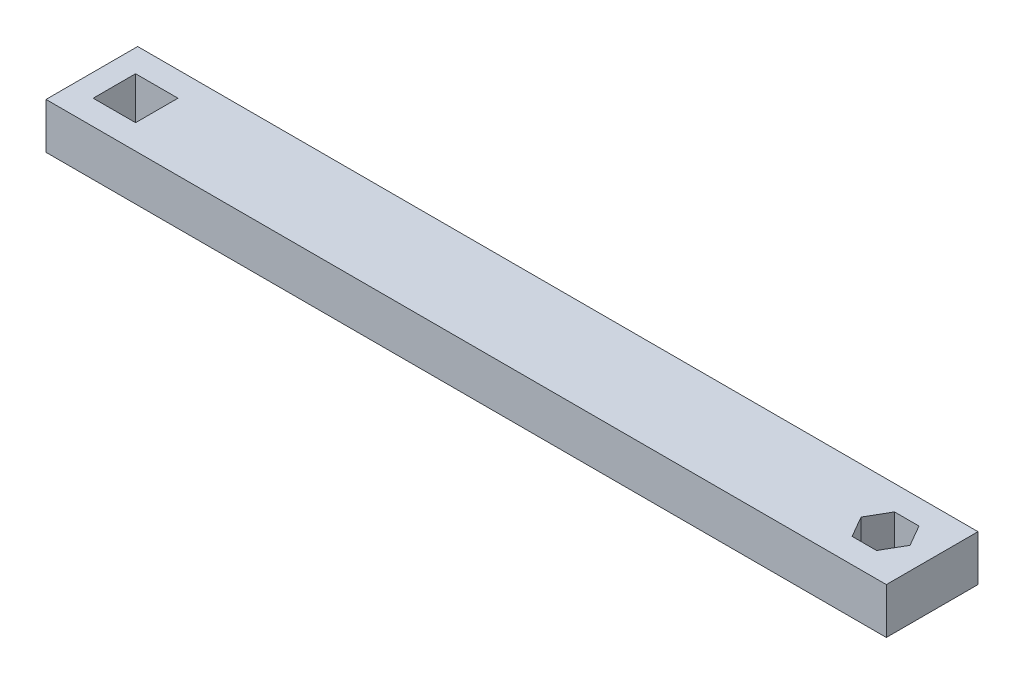
ISO-10303-21;
HEADER;
FILE_DESCRIPTION(('STEP AP214'),'2;1');
FILE_NAME('part.step','',(''),(''),'','','');
FILE_SCHEMA(('AUTOMOTIVE_DESIGN { 1 0 10303 214 1 1 1 1 }'));
ENDSEC;
DATA;
#1=APPLICATION_CONTEXT('core data for automotive mechanical design processes');
#2=APPLICATION_PROTOCOL_DEFINITION('international standard','automotive_design',2000,#1);
#3=PRODUCT_CONTEXT('',#1,'mechanical');
#4=PRODUCT('Part','Part','',(#3));
#5=PRODUCT_RELATED_PRODUCT_CATEGORY('part','',(#4));
#6=PRODUCT_DEFINITION_FORMATION('','',#4);
#7=PRODUCT_DEFINITION_CONTEXT('part definition',#1,'design');
#8=PRODUCT_DEFINITION('design','',#6,#7);
#9=PRODUCT_DEFINITION_SHAPE('','',#8);
#10=(LENGTH_UNIT() NAMED_UNIT(*) SI_UNIT(.MILLI.,.METRE.));
#11=(NAMED_UNIT(*) PLANE_ANGLE_UNIT() SI_UNIT($,.RADIAN.));
#12=(NAMED_UNIT(*) SI_UNIT($,.STERADIAN.) SOLID_ANGLE_UNIT());
#13=UNCERTAINTY_MEASURE_WITH_UNIT(LENGTH_MEASURE(1.E-05),#10,'distance_accuracy_value','');
#14=(GEOMETRIC_REPRESENTATION_CONTEXT(3) GLOBAL_UNCERTAINTY_ASSIGNED_CONTEXT((#13)) GLOBAL_UNIT_ASSIGNED_CONTEXT((#10,
#11,#12)) REPRESENTATION_CONTEXT('',''));
#15=CARTESIAN_POINT('',(0.,0.,0.));
#16=DIRECTION('',(0.,0.,1.));
#17=DIRECTION('',(1.,0.,0.));
#18=AXIS2_PLACEMENT_3D('',#15,#16,#17);
#19=CARTESIAN_POINT('',(0.,6.,84.2413308134273));
#20=DIRECTION('',(0.,0.,1.));
#21=DIRECTION('',(1.,0.,0.));
#22=AXIS2_PLACEMENT_3D('',#19,#20,#21);
#23=PLANE('',#22);
#24=DIRECTION('',(-1.,0.,0.));
#25=VECTOR('',#24,1.);
#26=CARTESIAN_POINT('',(0.,0.,84.2413308134273));
#27=LINE('',#26,#25);
#28=CARTESIAN_POINT('',(110.,0.,84.2413308134273));
#29=VERTEX_POINT('',#28);
#30=CARTESIAN_POINT('',(0.,0.,84.2413308134273));
#31=VERTEX_POINT('',#30);
#32=EDGE_CURVE('E213',#29,#31,#27,.T.);
#33=ORIENTED_EDGE('',*,*,#32,.T.);
#34=DIRECTION('',(0.,-1.,0.));
#35=VECTOR('',#34,1.);
#36=CARTESIAN_POINT('',(0.,6.,84.2413308134273));
#37=LINE('',#36,#35);
#38=CARTESIAN_POINT('',(0.,6.,84.2413308134273));
#39=VERTEX_POINT('',#38);
#40=EDGE_CURVE('E11',#39,#31,#37,.T.);
#41=ORIENTED_EDGE('',*,*,#40,.F.);
#42=DIRECTION('',(-1.,0.,0.));
#43=VECTOR('',#42,1.);
#44=CARTESIAN_POINT('',(0.,6.,84.2413308134273));
#45=LINE('',#44,#43);
#46=CARTESIAN_POINT('',(110.,6.,84.2413308134273));
#47=VERTEX_POINT('',#46);
#48=EDGE_CURVE('E220',#47,#39,#45,.T.);
#49=ORIENTED_EDGE('',*,*,#48,.F.);
#50=DIRECTION('',(0.,-1.,0.));
#51=VECTOR('',#50,1.);
#52=CARTESIAN_POINT('',(110.,6.,84.2413308134273));
#53=LINE('',#52,#51);
#54=EDGE_CURVE('E230',#47,#29,#53,.T.);
#55=ORIENTED_EDGE('',*,*,#54,.T.);
#56=EDGE_LOOP('',(#33,#41,#49,#55));
#57=FACE_BOUND('',#56,.T.);
#58=ADVANCED_FACE('F35',(#57),#23,.F.);
#59=CARTESIAN_POINT('',(0.,6.,84.2413308134273));
#60=DIRECTION('',(1.,0.,0.));
#61=DIRECTION('',(0.,0.,-1.));
#62=AXIS2_PLACEMENT_3D('',#59,#60,#61);
#63=PLANE('',#62);
#64=DIRECTION('',(0.,0.,1.));
#65=VECTOR('',#64,1.);
#66=CARTESIAN_POINT('',(0.,0.,84.2413308134273));
#67=LINE('',#66,#65);
#68=CARTESIAN_POINT('',(0.,0.,96.2413308134273));
#69=VERTEX_POINT('',#68);
#70=EDGE_CURVE('E233',#31,#69,#67,.T.);
#71=ORIENTED_EDGE('',*,*,#70,.T.);
#72=DIRECTION('',(0.,-1.,0.));
#73=VECTOR('',#72,1.);
#74=CARTESIAN_POINT('',(0.,6.,96.2413308134273));
#75=LINE('',#74,#73);
#76=CARTESIAN_POINT('',(0.,6.,96.2413308134273));
#77=VERTEX_POINT('',#76);
#78=EDGE_CURVE('E42',#77,#69,#75,.T.);
#79=ORIENTED_EDGE('',*,*,#78,.F.);
#80=DIRECTION('',(0.,0.,1.));
#81=VECTOR('',#80,1.);
#82=CARTESIAN_POINT('',(0.,6.,84.2413308134273));
#83=LINE('',#82,#81);
#84=EDGE_CURVE('E223',#39,#77,#83,.T.);
#85=ORIENTED_EDGE('',*,*,#84,.F.);
#86=ORIENTED_EDGE('',*,*,#40,.T.);
#87=EDGE_LOOP('',(#71,#79,#85,#86));
#88=FACE_BOUND('',#87,.T.);
#89=ADVANCED_FACE('F262',(#88),#63,.F.);
#90=CARTESIAN_POINT('',(0.,6.,96.2413308134273));
#91=DIRECTION('',(0.,0.,-1.));
#92=DIRECTION('',(-1.,0.,0.));
#93=AXIS2_PLACEMENT_3D('',#90,#91,#92);
#94=PLANE('',#93);
#95=DIRECTION('',(1.,0.,0.));
#96=VECTOR('',#95,1.);
#97=CARTESIAN_POINT('',(0.,0.,96.2413308134273));
#98=LINE('',#97,#96);
#99=CARTESIAN_POINT('',(110.,0.,96.2413308134273));
#100=VERTEX_POINT('',#99);
#101=EDGE_CURVE('E235',#69,#100,#98,.T.);
#102=ORIENTED_EDGE('',*,*,#101,.T.);
#103=DIRECTION('',(0.,-1.,0.));
#104=VECTOR('',#103,1.);
#105=CARTESIAN_POINT('',(110.,6.,96.2413308134273));
#106=LINE('',#105,#104);
#107=CARTESIAN_POINT('',(110.,6.,96.2413308134273));
#108=VERTEX_POINT('',#107);
#109=EDGE_CURVE('E240',#108,#100,#106,.T.);
#110=ORIENTED_EDGE('',*,*,#109,.F.);
#111=DIRECTION('',(1.,0.,0.));
#112=VECTOR('',#111,1.);
#113=CARTESIAN_POINT('',(0.,6.,96.2413308134273));
#114=LINE('',#113,#112);
#115=EDGE_CURVE('E226',#77,#108,#114,.T.);
#116=ORIENTED_EDGE('',*,*,#115,.F.);
#117=ORIENTED_EDGE('',*,*,#78,.T.);
#118=EDGE_LOOP('',(#102,#110,#116,#117));
#119=FACE_BOUND('',#118,.T.);
#120=ADVANCED_FACE('F247',(#119),#94,.F.);
#121=CARTESIAN_POINT('',(110.,6.,84.2413308134273));
#122=DIRECTION('',(-1.,0.,0.));
#123=DIRECTION('',(0.,0.,1.));
#124=AXIS2_PLACEMENT_3D('',#121,#122,#123);
#125=PLANE('',#124);
#126=DIRECTION('',(0.,0.,-1.));
#127=VECTOR('',#126,1.);
#128=CARTESIAN_POINT('',(110.,0.,84.2413308134273));
#129=LINE('',#128,#127);
#130=EDGE_CURVE('E224',#100,#29,#129,.T.);
#131=ORIENTED_EDGE('',*,*,#130,.T.);
#132=ORIENTED_EDGE('',*,*,#54,.F.);
#133=DIRECTION('',(0.,0.,-1.));
#134=VECTOR('',#133,1.);
#135=CARTESIAN_POINT('',(110.,6.,84.2413308134273));
#136=LINE('',#135,#134);
#137=EDGE_CURVE('E228',#108,#47,#136,.T.);
#138=ORIENTED_EDGE('',*,*,#137,.F.);
#139=ORIENTED_EDGE('',*,*,#109,.T.);
#140=EDGE_LOOP('',(#131,#132,#138,#139));
#141=FACE_BOUND('',#140,.T.);
#142=ADVANCED_FACE('F255',(#141),#125,.F.);
#143=CARTESIAN_POINT('',(0.,6.,0.));
#144=DIRECTION('',(0.,-1.,0.));
#145=DIRECTION('',(0.,0.,-1.));
#146=AXIS2_PLACEMENT_3D('',#143,#144,#145);
#147=PLANE('',#146);
#148=DIRECTION('',(1.,0.,0.));
#149=VECTOR('',#148,1.);
#150=CARTESIAN_POINT('',(102.295706005998,6.,93.0163308134273));
#151=LINE('',#150,#149);
#152=CARTESIAN_POINT('',(102.295706005998,6.,93.0163308134273));
#153=VERTEX_POINT('',#152);
#154=CARTESIAN_POINT('',(105.5,6.,93.0163308134273));
#155=VERTEX_POINT('',#154);
#156=EDGE_CURVE('E168',#153,#155,#151,.T.);
#157=ORIENTED_EDGE('',*,*,#156,.F.);
#158=DIRECTION('',(0.5,0.,0.866025403784439));
#159=VECTOR('',#158,1.);
#160=CARTESIAN_POINT('',(100.693559008996,6.,90.2413308134273));
#161=LINE('',#160,#159);
#162=CARTESIAN_POINT('',(100.693559008996,6.,90.2413308134273));
#163=VERTEX_POINT('',#162);
#164=EDGE_CURVE('E49',#163,#153,#161,.T.);
#165=ORIENTED_EDGE('',*,*,#164,.F.);
#166=DIRECTION('',(-0.500000000000001,0.,0.866025403784438));
#167=VECTOR('',#166,1.);
#168=CARTESIAN_POINT('',(102.295706005998,6.,87.4663308134273));
#169=LINE('',#168,#167);
#170=CARTESIAN_POINT('',(102.295706005998,6.,87.4663308134273));
#171=VERTEX_POINT('',#170);
#172=EDGE_CURVE('E154',#171,#163,#169,.T.);
#173=ORIENTED_EDGE('',*,*,#172,.F.);
#174=DIRECTION('',(-1.,0.,0.));
#175=VECTOR('',#174,1.);
#176=CARTESIAN_POINT('',(105.5,6.,87.4663308134273));
#177=LINE('',#176,#175);
#178=CARTESIAN_POINT('',(105.5,6.,87.4663308134273));
#179=VERTEX_POINT('',#178);
#180=EDGE_CURVE('E157',#179,#171,#177,.T.);
#181=ORIENTED_EDGE('',*,*,#180,.F.);
#182=DIRECTION('',(-0.500000000000002,0.,-0.866025403784438));
#183=VECTOR('',#182,1.);
#184=CARTESIAN_POINT('',(107.102146997001,6.,90.2413308134273));
#185=LINE('',#184,#183);
#186=CARTESIAN_POINT('',(107.102146997001,6.,90.2413308134273));
#187=VERTEX_POINT('',#186);
#188=EDGE_CURVE('E173',#187,#179,#185,.T.);
#189=ORIENTED_EDGE('',*,*,#188,.F.);
#190=DIRECTION('',(0.500000000000003,0.,-0.866025403784437));
#191=VECTOR('',#190,1.);
#192=CARTESIAN_POINT('',(105.5,6.,93.0163308134273));
#193=LINE('',#192,#191);
#194=EDGE_CURVE('E170',#155,#187,#193,.T.);
#195=ORIENTED_EDGE('',*,*,#194,.F.);
#196=EDGE_LOOP('',(#157,#165,#173,#181,#189,#195));
#197=FACE_BOUND('',#196,.T.);
#198=DIRECTION('',(1.,0.,0.));
#199=VECTOR('',#198,1.);
#200=CARTESIAN_POINT('',(2.95,6.,93.0163308134273));
#201=LINE('',#200,#199);
#202=CARTESIAN_POINT('',(2.95,6.,93.0163308134273));
#203=VERTEX_POINT('',#202);
#204=CARTESIAN_POINT('',(8.5,6.,93.0163308134273));
#205=VERTEX_POINT('',#204);
#206=EDGE_CURVE('E203',#203,#205,#201,.T.);
#207=ORIENTED_EDGE('',*,*,#206,.F.);
#208=DIRECTION('',(0.,0.,1.));
#209=VECTOR('',#208,1.);
#210=CARTESIAN_POINT('',(2.95,6.,87.4663308134273));
#211=LINE('',#210,#209);
#212=CARTESIAN_POINT('',(2.95,6.,87.4663308134273));
#213=VERTEX_POINT('',#212);
#214=EDGE_CURVE('E180',#213,#203,#211,.T.);
#215=ORIENTED_EDGE('',*,*,#214,.F.);
#216=DIRECTION('',(-1.,0.,0.));
#217=VECTOR('',#216,1.);
#218=CARTESIAN_POINT('',(2.95,6.,87.4663308134273));
#219=LINE('',#218,#217);
#220=CARTESIAN_POINT('',(8.5,6.,87.4663308134273));
#221=VERTEX_POINT('',#220);
#222=EDGE_CURVE('E192',#221,#213,#219,.T.);
#223=ORIENTED_EDGE('',*,*,#222,.F.);
#224=DIRECTION('',(0.,0.,-1.));
#225=VECTOR('',#224,1.);
#226=CARTESIAN_POINT('',(8.5,6.,87.4663308134273));
#227=LINE('',#226,#225);
#228=EDGE_CURVE('E206',#205,#221,#227,.T.);
#229=ORIENTED_EDGE('',*,*,#228,.F.);
#230=EDGE_LOOP('',(#207,#215,#223,#229));
#231=FACE_BOUND('',#230,.T.);
#232=ORIENTED_EDGE('',*,*,#48,.T.);
#233=ORIENTED_EDGE('',*,*,#84,.T.);
#234=ORIENTED_EDGE('',*,*,#115,.T.);
#235=ORIENTED_EDGE('',*,*,#137,.T.);
#236=EDGE_LOOP('',(#232,#233,#234,#235));
#237=FACE_BOUND('',#236,.T.);
#238=ADVANCED_FACE('F261',(#197,#231,#237),#147,.F.);
#239=CARTESIAN_POINT('',(0.,0.,0.));
#240=DIRECTION('',(0.,-1.,0.));
#241=DIRECTION('',(0.,0.,-1.));
#242=AXIS2_PLACEMENT_3D('',#239,#240,#241);
#243=PLANE('',#242);
#244=DIRECTION('',(0.5,0.,0.866025403784439));
#245=VECTOR('',#244,1.);
#246=CARTESIAN_POINT('',(100.693559008996,0.,90.2413308134273));
#247=LINE('',#246,#245);
#248=CARTESIAN_POINT('',(100.693559008996,0.,90.2413308134273));
#249=VERTEX_POINT('',#248);
#250=CARTESIAN_POINT('',(102.295706005998,0.,93.0163308134273));
#251=VERTEX_POINT('',#250);
#252=EDGE_CURVE('E137',#249,#251,#247,.T.);
#253=ORIENTED_EDGE('',*,*,#252,.T.);
#254=DIRECTION('',(1.,0.,0.));
#255=VECTOR('',#254,1.);
#256=CARTESIAN_POINT('',(102.295706005998,0.,93.0163308134273));
#257=LINE('',#256,#255);
#258=CARTESIAN_POINT('',(105.5,0.,93.0163308134273));
#259=VERTEX_POINT('',#258);
#260=EDGE_CURVE('E146',#251,#259,#257,.T.);
#261=ORIENTED_EDGE('',*,*,#260,.T.);
#262=DIRECTION('',(0.500000000000003,0.,-0.866025403784437));
#263=VECTOR('',#262,1.);
#264=CARTESIAN_POINT('',(105.5,0.,93.0163308134273));
#265=LINE('',#264,#263);
#266=CARTESIAN_POINT('',(107.102146997001,0.,90.2413308134273));
#267=VERTEX_POINT('',#266);
#268=EDGE_CURVE('E57',#259,#267,#265,.T.);
#269=ORIENTED_EDGE('',*,*,#268,.T.);
#270=DIRECTION('',(-0.500000000000002,0.,-0.866025403784438));
#271=VECTOR('',#270,1.);
#272=CARTESIAN_POINT('',(107.102146997001,0.,90.2413308134273));
#273=LINE('',#272,#271);
#274=CARTESIAN_POINT('',(105.5,0.,87.4663308134273));
#275=VERTEX_POINT('',#274);
#276=EDGE_CURVE('E161',#267,#275,#273,.T.);
#277=ORIENTED_EDGE('',*,*,#276,.T.);
#278=DIRECTION('',(-1.,0.,0.));
#279=VECTOR('',#278,1.);
#280=CARTESIAN_POINT('',(105.5,0.,87.4663308134273));
#281=LINE('',#280,#279);
#282=CARTESIAN_POINT('',(102.295706005998,0.,87.4663308134273));
#283=VERTEX_POINT('',#282);
#284=EDGE_CURVE('E164',#275,#283,#281,.T.);
#285=ORIENTED_EDGE('',*,*,#284,.T.);
#286=DIRECTION('',(-0.500000000000001,0.,0.866025403784438));
#287=VECTOR('',#286,1.);
#288=CARTESIAN_POINT('',(102.295706005998,0.,87.4663308134273));
#289=LINE('',#288,#287);
#290=EDGE_CURVE('E143',#283,#249,#289,.T.);
#291=ORIENTED_EDGE('',*,*,#290,.T.);
#292=EDGE_LOOP('',(#253,#261,#269,#277,#285,#291));
#293=FACE_BOUND('',#292,.T.);
#294=DIRECTION('',(0.,0.,1.));
#295=VECTOR('',#294,1.);
#296=CARTESIAN_POINT('',(2.95,0.,87.4663308134273));
#297=LINE('',#296,#295);
#298=CARTESIAN_POINT('',(2.95,0.,87.4663308134273));
#299=VERTEX_POINT('',#298);
#300=CARTESIAN_POINT('',(2.95,0.,93.0163308134273));
#301=VERTEX_POINT('',#300);
#302=EDGE_CURVE('E188',#299,#301,#297,.T.);
#303=ORIENTED_EDGE('',*,*,#302,.T.);
#304=DIRECTION('',(1.,0.,0.));
#305=VECTOR('',#304,1.);
#306=CARTESIAN_POINT('',(2.95,0.,93.0163308134273));
#307=LINE('',#306,#305);
#308=CARTESIAN_POINT('',(8.5,0.,93.0163308134273));
#309=VERTEX_POINT('',#308);
#310=EDGE_CURVE('E191',#301,#309,#307,.T.);
#311=ORIENTED_EDGE('',*,*,#310,.T.);
#312=DIRECTION('',(0.,0.,-1.));
#313=VECTOR('',#312,1.);
#314=CARTESIAN_POINT('',(8.5,0.,87.4663308134273));
#315=LINE('',#314,#313);
#316=CARTESIAN_POINT('',(8.5,0.,87.4663308134273));
#317=VERTEX_POINT('',#316);
#318=EDGE_CURVE('E195',#309,#317,#315,.T.);
#319=ORIENTED_EDGE('',*,*,#318,.T.);
#320=DIRECTION('',(-1.,0.,0.));
#321=VECTOR('',#320,1.);
#322=CARTESIAN_POINT('',(2.95,0.,87.4663308134273));
#323=LINE('',#322,#321);
#324=EDGE_CURVE('E198',#317,#299,#323,.T.);
#325=ORIENTED_EDGE('',*,*,#324,.T.);
#326=EDGE_LOOP('',(#303,#311,#319,#325));
#327=FACE_BOUND('',#326,.T.);
#328=ORIENTED_EDGE('',*,*,#32,.F.);
#329=ORIENTED_EDGE('',*,*,#130,.F.);
#330=ORIENTED_EDGE('',*,*,#101,.F.);
#331=ORIENTED_EDGE('',*,*,#70,.F.);
#332=EDGE_LOOP('',(#328,#329,#330,#331));
#333=FACE_BOUND('',#332,.T.);
#334=ADVANCED_FACE('F150',(#293,#327,#333),#243,.T.);
#335=CARTESIAN_POINT('',(2.95,0.,87.4663308134273));
#336=DIRECTION('',(-1.,0.,0.));
#337=DIRECTION('',(0.,0.,1.));
#338=AXIS2_PLACEMENT_3D('',#335,#336,#337);
#339=PLANE('',#338);
#340=ORIENTED_EDGE('',*,*,#214,.T.);
#341=DIRECTION('',(0.,1.,0.));
#342=VECTOR('',#341,1.);
#343=CARTESIAN_POINT('',(2.95,0.,93.0163308134273));
#344=LINE('',#343,#342);
#345=EDGE_CURVE('E201',#301,#203,#344,.T.);
#346=ORIENTED_EDGE('',*,*,#345,.F.);
#347=ORIENTED_EDGE('',*,*,#302,.F.);
#348=DIRECTION('',(0.,1.,0.));
#349=VECTOR('',#348,1.);
#350=CARTESIAN_POINT('',(2.95,0.,87.4663308134273));
#351=LINE('',#350,#349);
#352=EDGE_CURVE('E211',#299,#213,#351,.T.);
#353=ORIENTED_EDGE('',*,*,#352,.T.);
#354=EDGE_LOOP('',(#340,#346,#347,#353));
#355=FACE_BOUND('',#354,.T.);
#356=ADVANCED_FACE('F274',(#355),#339,.F.);
#357=CARTESIAN_POINT('',(2.95,0.,87.4663308134273));
#358=DIRECTION('',(0.,0.,-1.));
#359=DIRECTION('',(-1.,0.,0.));
#360=AXIS2_PLACEMENT_3D('',#357,#358,#359);
#361=PLANE('',#360);
#362=ORIENTED_EDGE('',*,*,#222,.T.);
#363=ORIENTED_EDGE('',*,*,#352,.F.);
#364=ORIENTED_EDGE('',*,*,#324,.F.);
#365=DIRECTION('',(0.,1.,0.));
#366=VECTOR('',#365,1.);
#367=CARTESIAN_POINT('',(8.5,0.,87.4663308134273));
#368=LINE('',#367,#366);
#369=EDGE_CURVE('E214',#317,#221,#368,.T.);
#370=ORIENTED_EDGE('',*,*,#369,.T.);
#371=EDGE_LOOP('',(#362,#363,#364,#370));
#372=FACE_BOUND('',#371,.T.);
#373=ADVANCED_FACE('F280',(#372),#361,.F.);
#374=CARTESIAN_POINT('',(8.5,0.,87.4663308134273));
#375=DIRECTION('',(1.,0.,0.));
#376=DIRECTION('',(0.,0.,-1.));
#377=AXIS2_PLACEMENT_3D('',#374,#375,#376);
#378=PLANE('',#377);
#379=ORIENTED_EDGE('',*,*,#228,.T.);
#380=ORIENTED_EDGE('',*,*,#369,.F.);
#381=ORIENTED_EDGE('',*,*,#318,.F.);
#382=DIRECTION('',(0.,1.,0.));
#383=VECTOR('',#382,1.);
#384=CARTESIAN_POINT('',(8.5,0.,93.0163308134273));
#385=LINE('',#384,#383);
#386=EDGE_CURVE('E216',#309,#205,#385,.T.);
#387=ORIENTED_EDGE('',*,*,#386,.T.);
#388=EDGE_LOOP('',(#379,#380,#381,#387));
#389=FACE_BOUND('',#388,.T.);
#390=ADVANCED_FACE('F285',(#389),#378,.F.);
#391=CARTESIAN_POINT('',(2.95,0.,93.0163308134273));
#392=DIRECTION('',(0.,0.,1.));
#393=DIRECTION('',(1.,0.,0.));
#394=AXIS2_PLACEMENT_3D('',#391,#392,#393);
#395=PLANE('',#394);
#396=ORIENTED_EDGE('',*,*,#206,.T.);
#397=ORIENTED_EDGE('',*,*,#386,.F.);
#398=ORIENTED_EDGE('',*,*,#310,.F.);
#399=ORIENTED_EDGE('',*,*,#345,.T.);
#400=EDGE_LOOP('',(#396,#397,#398,#399));
#401=FACE_BOUND('',#400,.T.);
#402=ADVANCED_FACE('F282',(#401),#395,.F.);
#403=CARTESIAN_POINT('',(100.693559008996,0.,90.2413308134273));
#404=DIRECTION('',(-0.866025403784439,0.,0.5));
#405=DIRECTION('',(0.5,0.,0.866025403784439));
#406=AXIS2_PLACEMENT_3D('',#403,#404,#405);
#407=PLANE('',#406);
#408=ORIENTED_EDGE('',*,*,#164,.T.);
#409=DIRECTION('',(0.,1.,0.));
#410=VECTOR('',#409,1.);
#411=CARTESIAN_POINT('',(102.295706005998,0.,93.0163308134273));
#412=LINE('',#411,#410);
#413=EDGE_CURVE('E133',#251,#153,#412,.T.);
#414=ORIENTED_EDGE('',*,*,#413,.F.);
#415=ORIENTED_EDGE('',*,*,#252,.F.);
#416=DIRECTION('',(0.,1.,0.));
#417=VECTOR('',#416,1.);
#418=CARTESIAN_POINT('',(100.693559008996,0.,90.2413308134273));
#419=LINE('',#418,#417);
#420=EDGE_CURVE('E178',#249,#163,#419,.T.);
#421=ORIENTED_EDGE('',*,*,#420,.T.);
#422=EDGE_LOOP('',(#408,#414,#415,#421));
#423=FACE_BOUND('',#422,.T.);
#424=ADVANCED_FACE('F135',(#423),#407,.F.);
#425=CARTESIAN_POINT('',(102.295706005998,0.,87.4663308134273));
#426=DIRECTION('',(-0.866025403784438,0.,-0.500000000000001));
#427=DIRECTION('',(-0.500000000000001,0.,0.866025403784438));
#428=AXIS2_PLACEMENT_3D('',#425,#426,#427);
#429=PLANE('',#428);
#430=ORIENTED_EDGE('',*,*,#172,.T.);
#431=ORIENTED_EDGE('',*,*,#420,.F.);
#432=ORIENTED_EDGE('',*,*,#290,.F.);
#433=DIRECTION('',(0.,1.,0.));
#434=VECTOR('',#433,1.);
#435=CARTESIAN_POINT('',(102.295706005998,0.,87.4663308134273));
#436=LINE('',#435,#434);
#437=EDGE_CURVE('E181',#283,#171,#436,.T.);
#438=ORIENTED_EDGE('',*,*,#437,.T.);
#439=EDGE_LOOP('',(#430,#431,#432,#438));
#440=FACE_BOUND('',#439,.T.);
#441=ADVANCED_FACE('F295',(#440),#429,.F.);
#442=CARTESIAN_POINT('',(105.5,0.,87.4663308134273));
#443=DIRECTION('',(0.,0.,-1.));
#444=DIRECTION('',(-1.,0.,0.));
#445=AXIS2_PLACEMENT_3D('',#442,#443,#444);
#446=PLANE('',#445);
#447=ORIENTED_EDGE('',*,*,#180,.T.);
#448=ORIENTED_EDGE('',*,*,#437,.F.);
#449=ORIENTED_EDGE('',*,*,#284,.F.);
#450=DIRECTION('',(0.,1.,0.));
#451=VECTOR('',#450,1.);
#452=CARTESIAN_POINT('',(105.5,0.,87.4663308134273));
#453=LINE('',#452,#451);
#454=EDGE_CURVE('E183',#275,#179,#453,.T.);
#455=ORIENTED_EDGE('',*,*,#454,.T.);
#456=EDGE_LOOP('',(#447,#448,#449,#455));
#457=FACE_BOUND('',#456,.T.);
#458=ADVANCED_FACE('F304',(#457),#446,.F.);
#459=CARTESIAN_POINT('',(107.102146997001,0.,90.2413308134273));
#460=DIRECTION('',(0.866025403784438,0.,-0.500000000000002));
#461=DIRECTION('',(-0.500000000000002,0.,-0.866025403784438));
#462=AXIS2_PLACEMENT_3D('',#459,#460,#461);
#463=PLANE('',#462);
#464=ORIENTED_EDGE('',*,*,#188,.T.);
#465=ORIENTED_EDGE('',*,*,#454,.F.);
#466=ORIENTED_EDGE('',*,*,#276,.F.);
#467=DIRECTION('',(0.,1.,0.));
#468=VECTOR('',#467,1.);
#469=CARTESIAN_POINT('',(107.102146997001,0.,90.2413308134273));
#470=LINE('',#469,#468);
#471=EDGE_CURVE('E185',#267,#187,#470,.T.);
#472=ORIENTED_EDGE('',*,*,#471,.T.);
#473=EDGE_LOOP('',(#464,#465,#466,#472));
#474=FACE_BOUND('',#473,.T.);
#475=ADVANCED_FACE('F301',(#474),#463,.F.);
#476=CARTESIAN_POINT('',(105.5,0.,93.0163308134273));
#477=DIRECTION('',(0.866025403784437,0.,0.500000000000002));
#478=DIRECTION('',(0.500000000000003,0.,-0.866025403784437));
#479=AXIS2_PLACEMENT_3D('',#476,#477,#478);
#480=PLANE('',#479);
#481=ORIENTED_EDGE('',*,*,#194,.T.);
#482=ORIENTED_EDGE('',*,*,#471,.F.);
#483=ORIENTED_EDGE('',*,*,#268,.F.);
#484=DIRECTION('',(0.,1.,0.));
#485=VECTOR('',#484,1.);
#486=CARTESIAN_POINT('',(105.5,0.,93.0163308134273));
#487=LINE('',#486,#485);
#488=EDGE_CURVE('E142',#259,#155,#487,.T.);
#489=ORIENTED_EDGE('',*,*,#488,.T.);
#490=EDGE_LOOP('',(#481,#482,#483,#489));
#491=FACE_BOUND('',#490,.T.);
#492=ADVANCED_FACE('F298',(#491),#480,.F.);
#493=CARTESIAN_POINT('',(102.295706005998,0.,93.0163308134273));
#494=DIRECTION('',(0.,0.,1.));
#495=DIRECTION('',(1.,0.,0.));
#496=AXIS2_PLACEMENT_3D('',#493,#494,#495);
#497=PLANE('',#496);
#498=ORIENTED_EDGE('',*,*,#156,.T.);
#499=ORIENTED_EDGE('',*,*,#488,.F.);
#500=ORIENTED_EDGE('',*,*,#260,.F.);
#501=ORIENTED_EDGE('',*,*,#413,.T.);
#502=EDGE_LOOP('',(#498,#499,#500,#501));
#503=FACE_BOUND('',#502,.T.);
#504=ADVANCED_FACE('F147',(#503),#497,.F.);
#505=CLOSED_SHELL('',(#58,#89,#120,#142,#238,#334,#356,#373,#390,#402,#424,#441,#458,#475,#492,#504));
#506=MANIFOLD_SOLID_BREP('B2',#505);
#507=ADVANCED_BREP_SHAPE_REPRESENTATION('',(#18,#506),#14);
#508=SHAPE_DEFINITION_REPRESENTATION(#9,#507);
ENDSEC;
END-ISO-10303-21;
